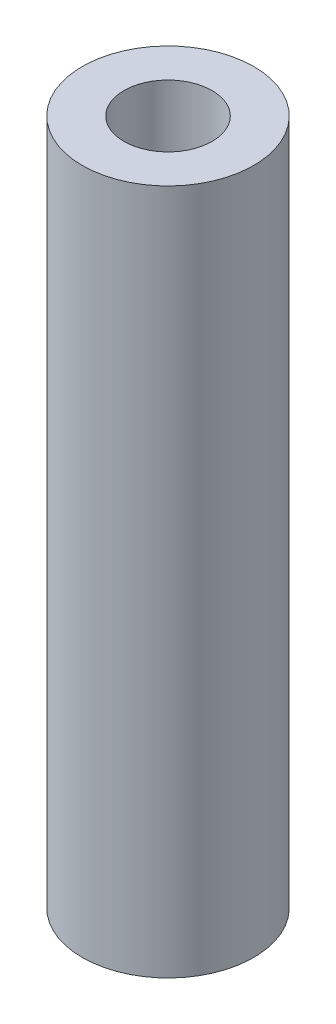
ISO-10303-21;
HEADER;
FILE_DESCRIPTION(('STEP AP214'),'2;1');
FILE_NAME('part.step','',(''),(''),'','','');
FILE_SCHEMA(('AUTOMOTIVE_DESIGN { 1 0 10303 214 1 1 1 1 }'));
ENDSEC;
DATA;
#1=APPLICATION_CONTEXT('core data for automotive mechanical design processes');
#2=APPLICATION_PROTOCOL_DEFINITION('international standard','automotive_design',2000,#1);
#3=PRODUCT_CONTEXT('',#1,'mechanical');
#4=PRODUCT('Part','Part','',(#3));
#5=PRODUCT_RELATED_PRODUCT_CATEGORY('part','',(#4));
#6=PRODUCT_DEFINITION_FORMATION('','',#4);
#7=PRODUCT_DEFINITION_CONTEXT('part definition',#1,'design');
#8=PRODUCT_DEFINITION('design','',#6,#7);
#9=PRODUCT_DEFINITION_SHAPE('','',#8);
#10=(LENGTH_UNIT() NAMED_UNIT(*) SI_UNIT(.MILLI.,.METRE.));
#11=(NAMED_UNIT(*) PLANE_ANGLE_UNIT() SI_UNIT($,.RADIAN.));
#12=(NAMED_UNIT(*) SI_UNIT($,.STERADIAN.) SOLID_ANGLE_UNIT());
#13=UNCERTAINTY_MEASURE_WITH_UNIT(LENGTH_MEASURE(1.E-05),#10,'distance_accuracy_value','');
#14=(GEOMETRIC_REPRESENTATION_CONTEXT(3) GLOBAL_UNCERTAINTY_ASSIGNED_CONTEXT((#13)) GLOBAL_UNIT_ASSIGNED_CONTEXT((#10,
#11,#12)) REPRESENTATION_CONTEXT('',''));
#15=CARTESIAN_POINT('',(0.,0.,0.));
#16=DIRECTION('',(0.,0.,1.));
#17=DIRECTION('',(1.,0.,0.));
#18=AXIS2_PLACEMENT_3D('',#15,#16,#17);
#19=CARTESIAN_POINT('',(0.,25.4,0.));
#20=DIRECTION('',(0.,-1.,0.));
#21=DIRECTION('',(0.,0.,-1.));
#22=AXIS2_PLACEMENT_3D('',#19,#20,#21);
#23=CYLINDRICAL_SURFACE('',#22,3.175);
#24=CARTESIAN_POINT('',(0.,25.4,0.));
#25=DIRECTION('',(0.,1.,0.));
#26=DIRECTION('',(0.,0.,1.));
#27=AXIS2_PLACEMENT_3D('',#24,#25,#26);
#28=CIRCLE('',#27,3.175);
#29=CARTESIAN_POINT('',(0.,25.4,3.175));
#30=VERTEX_POINT('',#29);
#31=EDGE_CURVE('E10',#30,#30,#28,.T.);
#32=ORIENTED_EDGE('',*,*,#31,.F.);
#33=EDGE_LOOP('',(#32));
#34=FACE_BOUND('',#33,.T.);
#35=CARTESIAN_POINT('',(0.,0.,0.));
#36=DIRECTION('',(0.,1.,0.));
#37=DIRECTION('',(0.,0.,1.));
#38=AXIS2_PLACEMENT_3D('',#35,#36,#37);
#39=CIRCLE('',#38,3.175);
#40=CARTESIAN_POINT('',(0.,0.,3.175));
#41=VERTEX_POINT('',#40);
#42=EDGE_CURVE('E33',#41,#41,#39,.T.);
#43=ORIENTED_EDGE('',*,*,#42,.T.);
#44=EDGE_LOOP('',(#43));
#45=FACE_BOUND('',#44,.T.);
#46=ADVANCED_FACE('F30',(#34,#45),#23,.T.);
#47=CARTESIAN_POINT('',(0.,25.4,0.));
#48=DIRECTION('',(0.,1.,0.));
#49=DIRECTION('',(0.,0.,1.));
#50=AXIS2_PLACEMENT_3D('',#47,#48,#49);
#51=PLANE('',#50);
#52=CARTESIAN_POINT('',(0.,25.4,0.));
#53=DIRECTION('',(0.,1.,0.));
#54=DIRECTION('',(0.,0.,1.));
#55=AXIS2_PLACEMENT_3D('',#52,#53,#54);
#56=CIRCLE('',#55,1.63195);
#57=CARTESIAN_POINT('',(0.,25.4,1.63195));
#58=VERTEX_POINT('',#57);
#59=EDGE_CURVE('E42',#58,#58,#56,.T.);
#60=ORIENTED_EDGE('',*,*,#59,.F.);
#61=EDGE_LOOP('',(#60));
#62=FACE_BOUND('',#61,.T.);
#63=ORIENTED_EDGE('',*,*,#31,.T.);
#64=EDGE_LOOP('',(#63));
#65=FACE_BOUND('',#64,.T.);
#66=ADVANCED_FACE('F57',(#62,#65),#51,.T.);
#67=CARTESIAN_POINT('',(0.,0.,0.));
#68=DIRECTION('',(0.,1.,0.));
#69=DIRECTION('',(0.,0.,1.));
#70=AXIS2_PLACEMENT_3D('',#67,#68,#69);
#71=PLANE('',#70);
#72=CARTESIAN_POINT('',(0.,0.,0.));
#73=DIRECTION('',(0.,1.,0.));
#74=DIRECTION('',(0.,0.,1.));
#75=AXIS2_PLACEMENT_3D('',#72,#73,#74);
#76=CIRCLE('',#75,1.63195);
#77=CARTESIAN_POINT('',(0.,0.,1.63195));
#78=VERTEX_POINT('',#77);
#79=EDGE_CURVE('E40',#78,#78,#76,.T.);
#80=ORIENTED_EDGE('',*,*,#79,.T.);
#81=EDGE_LOOP('',(#80));
#82=FACE_BOUND('',#81,.T.);
#83=ORIENTED_EDGE('',*,*,#42,.F.);
#84=EDGE_LOOP('',(#83));
#85=FACE_BOUND('',#84,.T.);
#86=ADVANCED_FACE('F48',(#82,#85),#71,.F.);
#87=CARTESIAN_POINT('',(0.,0.,0.));
#88=DIRECTION('',(0.,1.,0.));
#89=DIRECTION('',(0.,0.,1.));
#90=AXIS2_PLACEMENT_3D('',#87,#88,#89);
#91=CYLINDRICAL_SURFACE('',#90,1.63195);
#92=ORIENTED_EDGE('',*,*,#79,.F.);
#93=EDGE_LOOP('',(#92));
#94=FACE_BOUND('',#93,.T.);
#95=ORIENTED_EDGE('',*,*,#59,.T.);
#96=EDGE_LOOP('',(#95));
#97=FACE_BOUND('',#96,.T.);
#98=ADVANCED_FACE('F51',(#94,#97),#91,.F.);
#99=CLOSED_SHELL('',(#46,#66,#86,#98));
#100=MANIFOLD_SOLID_BREP('B2',#99);
#101=ADVANCED_BREP_SHAPE_REPRESENTATION('',(#18,#100),#14);
#102=SHAPE_DEFINITION_REPRESENTATION(#9,#101);
ENDSEC;
END-ISO-10303-21;
